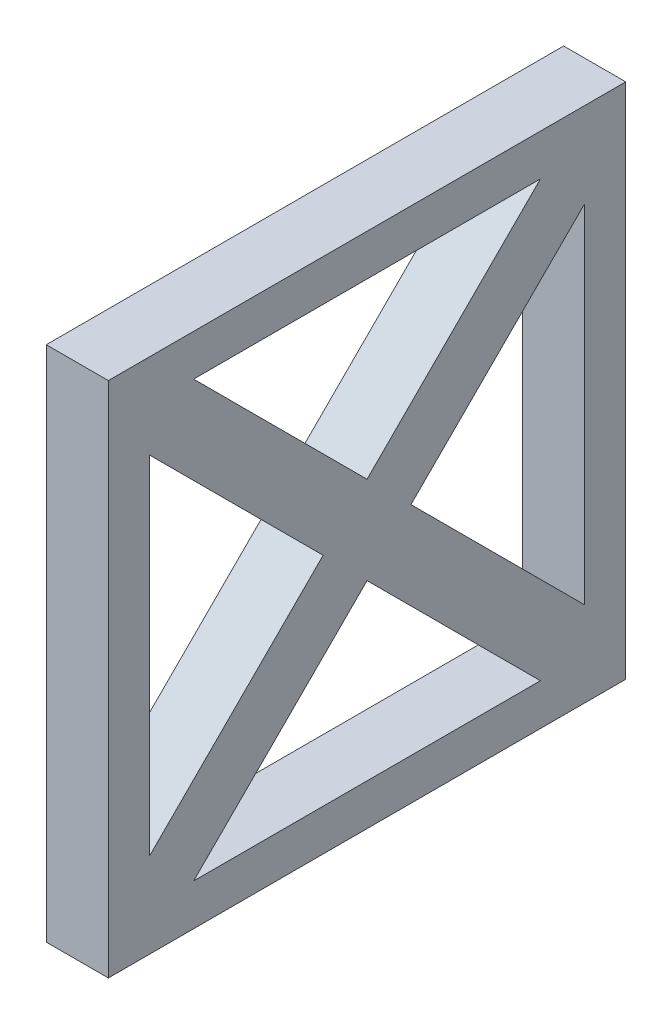
ISO-10303-21;
HEADER;
FILE_DESCRIPTION(('STEP AP214'),'2;1');
FILE_NAME('part.step','',(''),(''),'','','');
FILE_SCHEMA(('AUTOMOTIVE_DESIGN { 1 0 10303 214 1 1 1 1 }'));
ENDSEC;
DATA;
#1=APPLICATION_CONTEXT('core data for automotive mechanical design processes');
#2=APPLICATION_PROTOCOL_DEFINITION('international standard','automotive_design',2000,#1);
#3=PRODUCT_CONTEXT('',#1,'mechanical');
#4=PRODUCT('Part','Part','',(#3));
#5=PRODUCT_RELATED_PRODUCT_CATEGORY('part','',(#4));
#6=PRODUCT_DEFINITION_FORMATION('','',#4);
#7=PRODUCT_DEFINITION_CONTEXT('part definition',#1,'design');
#8=PRODUCT_DEFINITION('design','',#6,#7);
#9=PRODUCT_DEFINITION_SHAPE('','',#8);
#10=(LENGTH_UNIT() NAMED_UNIT(*) SI_UNIT(.MILLI.,.METRE.));
#11=(NAMED_UNIT(*) PLANE_ANGLE_UNIT() SI_UNIT($,.RADIAN.));
#12=(NAMED_UNIT(*) SI_UNIT($,.STERADIAN.) SOLID_ANGLE_UNIT());
#13=UNCERTAINTY_MEASURE_WITH_UNIT(LENGTH_MEASURE(1.E-05),#10,'distance_accuracy_value','');
#14=(GEOMETRIC_REPRESENTATION_CONTEXT(3) GLOBAL_UNCERTAINTY_ASSIGNED_CONTEXT((#13)) GLOBAL_UNIT_ASSIGNED_CONTEXT((#10,
#11,#12)) REPRESENTATION_CONTEXT('',''));
#15=CARTESIAN_POINT('',(0.,0.,0.));
#16=DIRECTION('',(0.,0.,1.));
#17=DIRECTION('',(1.,0.,0.));
#18=AXIS2_PLACEMENT_3D('',#15,#16,#17);
#19=CARTESIAN_POINT('',(6.,-25.,0.));
#20=DIRECTION('',(0.,-1.,0.));
#21=DIRECTION('',(0.,0.,-1.));
#22=AXIS2_PLACEMENT_3D('',#19,#20,#21);
#23=PLANE('',#22);
#24=DIRECTION('',(0.,0.,1.));
#25=VECTOR('',#24,1.);
#26=CARTESIAN_POINT('',(0.,-25.,0.));
#27=LINE('',#26,#25);
#28=CARTESIAN_POINT('',(0.,-25.,-25.));
#29=VERTEX_POINT('',#28);
#30=CARTESIAN_POINT('',(0.,-25.,25.));
#31=VERTEX_POINT('',#30);
#32=EDGE_CURVE('E290',#29,#31,#27,.T.);
#33=ORIENTED_EDGE('',*,*,#32,.F.);
#34=DIRECTION('',(-1.,0.,0.));
#35=VECTOR('',#34,1.);
#36=CARTESIAN_POINT('',(6.,-25.,-25.));
#37=LINE('',#36,#35);
#38=CARTESIAN_POINT('',(6.,-25.,-25.));
#39=VERTEX_POINT('',#38);
#40=EDGE_CURVE('E11',#39,#29,#37,.T.);
#41=ORIENTED_EDGE('',*,*,#40,.F.);
#42=DIRECTION('',(0.,0.,1.));
#43=VECTOR('',#42,1.);
#44=CARTESIAN_POINT('',(6.,-25.,0.));
#45=LINE('',#44,#43);
#46=CARTESIAN_POINT('',(6.,-25.,25.));
#47=VERTEX_POINT('',#46);
#48=EDGE_CURVE('E182',#39,#47,#45,.T.);
#49=ORIENTED_EDGE('',*,*,#48,.T.);
#50=DIRECTION('',(-1.,0.,0.));
#51=VECTOR('',#50,1.);
#52=CARTESIAN_POINT('',(6.,-25.,25.));
#53=LINE('',#52,#51);
#54=EDGE_CURVE('E67',#47,#31,#53,.T.);
#55=ORIENTED_EDGE('',*,*,#54,.T.);
#56=EDGE_LOOP('',(#33,#41,#49,#55));
#57=FACE_BOUND('',#56,.T.);
#58=ADVANCED_FACE('F47',(#57),#23,.T.);
#59=CARTESIAN_POINT('',(6.,0.,-25.));
#60=DIRECTION('',(0.,0.,1.));
#61=DIRECTION('',(1.,0.,0.));
#62=AXIS2_PLACEMENT_3D('',#59,#60,#61);
#63=PLANE('',#62);
#64=DIRECTION('',(0.,1.,0.));
#65=VECTOR('',#64,1.);
#66=CARTESIAN_POINT('',(0.,0.,-25.));
#67=LINE('',#66,#65);
#68=CARTESIAN_POINT('',(0.,25.,-25.));
#69=VERTEX_POINT('',#68);
#70=EDGE_CURVE('E188',#29,#69,#67,.T.);
#71=ORIENTED_EDGE('',*,*,#70,.T.);
#72=DIRECTION('',(-1.,0.,0.));
#73=VECTOR('',#72,1.);
#74=CARTESIAN_POINT('',(6.,25.,-25.));
#75=LINE('',#74,#73);
#76=CARTESIAN_POINT('',(6.,25.,-25.));
#77=VERTEX_POINT('',#76);
#78=EDGE_CURVE('E58',#77,#69,#75,.T.);
#79=ORIENTED_EDGE('',*,*,#78,.F.);
#80=DIRECTION('',(0.,1.,0.));
#81=VECTOR('',#80,1.);
#82=CARTESIAN_POINT('',(6.,0.,-25.));
#83=LINE('',#82,#81);
#84=EDGE_CURVE('E177',#39,#77,#83,.T.);
#85=ORIENTED_EDGE('',*,*,#84,.F.);
#86=ORIENTED_EDGE('',*,*,#40,.T.);
#87=EDGE_LOOP('',(#71,#79,#85,#86));
#88=FACE_BOUND('',#87,.T.);
#89=ADVANCED_FACE('F186',(#88),#63,.F.);
#90=CARTESIAN_POINT('',(6.,25.,0.));
#91=DIRECTION('',(0.,-1.,0.));
#92=DIRECTION('',(0.,0.,-1.));
#93=AXIS2_PLACEMENT_3D('',#90,#91,#92);
#94=PLANE('',#93);
#95=DIRECTION('',(0.,0.,1.));
#96=VECTOR('',#95,1.);
#97=CARTESIAN_POINT('',(0.,25.,0.));
#98=LINE('',#97,#96);
#99=CARTESIAN_POINT('',(0.,25.,25.));
#100=VERTEX_POINT('',#99);
#101=EDGE_CURVE('E295',#69,#100,#98,.T.);
#102=ORIENTED_EDGE('',*,*,#101,.T.);
#103=DIRECTION('',(-1.,0.,0.));
#104=VECTOR('',#103,1.);
#105=CARTESIAN_POINT('',(6.,25.,25.));
#106=LINE('',#105,#104);
#107=CARTESIAN_POINT('',(6.,25.,25.));
#108=VERTEX_POINT('',#107);
#109=EDGE_CURVE('E117',#108,#100,#106,.T.);
#110=ORIENTED_EDGE('',*,*,#109,.F.);
#111=DIRECTION('',(0.,0.,1.));
#112=VECTOR('',#111,1.);
#113=CARTESIAN_POINT('',(6.,25.,0.));
#114=LINE('',#113,#112);
#115=EDGE_CURVE('E168',#77,#108,#114,.T.);
#116=ORIENTED_EDGE('',*,*,#115,.F.);
#117=ORIENTED_EDGE('',*,*,#78,.T.);
#118=EDGE_LOOP('',(#102,#110,#116,#117));
#119=FACE_BOUND('',#118,.T.);
#120=ADVANCED_FACE('F170',(#119),#94,.F.);
#121=CARTESIAN_POINT('',(6.,-2.12132034355963,2.12132034355963));
#122=DIRECTION('',(0.,0.707106781186547,-0.707106781186547));
#123=DIRECTION('',(0.,0.707106781186548,0.707106781186548));
#124=AXIS2_PLACEMENT_3D('',#121,#122,#123);
#125=PLANE('',#124);
#126=DIRECTION('',(0.,-0.707106781186548,-0.707106781186548));
#127=VECTOR('',#126,1.);
#128=CARTESIAN_POINT('',(0.,-2.12132034355963,2.12132034355963));
#129=LINE('',#128,#127);
#130=CARTESIAN_POINT('',(0.,16.7573593128807,21.));
#131=VERTEX_POINT('',#130);
#132=CARTESIAN_POINT('',(0.,0.,4.24264068711927));
#133=VERTEX_POINT('',#132);
#134=EDGE_CURVE('E279',#131,#133,#129,.T.);
#135=ORIENTED_EDGE('',*,*,#134,.T.);
#136=DIRECTION('',(-1.,0.,0.));
#137=VECTOR('',#136,1.);
#138=CARTESIAN_POINT('',(6.,0.,4.24264068711927));
#139=LINE('',#138,#137);
#140=CARTESIAN_POINT('',(6.,0.,4.24264068711927));
#141=VERTEX_POINT('',#140);
#142=EDGE_CURVE('E203',#141,#133,#139,.T.);
#143=ORIENTED_EDGE('',*,*,#142,.F.);
#144=DIRECTION('',(0.,-0.707106781186548,-0.707106781186548));
#145=VECTOR('',#144,1.);
#146=CARTESIAN_POINT('',(6.,-2.12132034355963,2.12132034355963));
#147=LINE('',#146,#145);
#148=CARTESIAN_POINT('',(6.,16.7573593128807,21.));
#149=VERTEX_POINT('',#148);
#150=EDGE_CURVE('E335',#149,#141,#147,.T.);
#151=ORIENTED_EDGE('',*,*,#150,.F.);
#152=DIRECTION('',(-1.,0.,0.));
#153=VECTOR('',#152,1.);
#154=CARTESIAN_POINT('',(6.,16.7573593128807,21.));
#155=LINE('',#154,#153);
#156=EDGE_CURVE('E195',#149,#131,#155,.T.);
#157=ORIENTED_EDGE('',*,*,#156,.T.);
#158=EDGE_LOOP('',(#135,#143,#151,#157));
#159=FACE_BOUND('',#158,.T.);
#160=ADVANCED_FACE('F377',(#159),#125,.F.);
#161=CARTESIAN_POINT('',(6.,2.12132034355963,2.12132034355963));
#162=DIRECTION('',(0.,0.707106781186547,0.707106781186547));
#163=DIRECTION('',(0.,-0.707106781186548,0.707106781186548));
#164=AXIS2_PLACEMENT_3D('',#161,#162,#163);
#165=PLANE('',#164);
#166=DIRECTION('',(0.,0.707106781186548,-0.707106781186548));
#167=VECTOR('',#166,1.);
#168=CARTESIAN_POINT('',(0.,2.12132034355963,2.12132034355963));
#169=LINE('',#168,#167);
#170=CARTESIAN_POINT('',(0.,-16.7573593128807,21.));
#171=VERTEX_POINT('',#170);
#172=EDGE_CURVE('E283',#171,#133,#169,.T.);
#173=ORIENTED_EDGE('',*,*,#172,.F.);
#174=DIRECTION('',(-1.,0.,0.));
#175=VECTOR('',#174,1.);
#176=CARTESIAN_POINT('',(6.,-16.7573593128807,21.));
#177=LINE('',#176,#175);
#178=CARTESIAN_POINT('',(6.,-16.7573593128807,21.));
#179=VERTEX_POINT('',#178);
#180=EDGE_CURVE('E199',#179,#171,#177,.T.);
#181=ORIENTED_EDGE('',*,*,#180,.F.);
#182=DIRECTION('',(0.,0.707106781186548,-0.707106781186548));
#183=VECTOR('',#182,1.);
#184=CARTESIAN_POINT('',(6.,2.12132034355963,2.12132034355963));
#185=LINE('',#184,#183);
#186=EDGE_CURVE('E338',#179,#141,#185,.T.);
#187=ORIENTED_EDGE('',*,*,#186,.T.);
#188=ORIENTED_EDGE('',*,*,#142,.T.);
#189=EDGE_LOOP('',(#173,#181,#187,#188));
#190=FACE_BOUND('',#189,.T.);
#191=ADVANCED_FACE('F373',(#190),#165,.T.);
#192=CARTESIAN_POINT('',(6.,-2.12132034355964,-2.12132034355964));
#193=DIRECTION('',(0.,0.707106781186547,0.707106781186547));
#194=DIRECTION('',(0.,-0.707106781186548,0.707106781186548));
#195=AXIS2_PLACEMENT_3D('',#192,#193,#194);
#196=PLANE('',#195);
#197=DIRECTION('',(0.,0.707106781186548,-0.707106781186548));
#198=VECTOR('',#197,1.);
#199=CARTESIAN_POINT('',(0.,-2.12132034355964,-2.12132034355964));
#200=LINE('',#199,#198);
#201=CARTESIAN_POINT('',(0.,-21.,16.7573593128807));
#202=VERTEX_POINT('',#201);
#203=CARTESIAN_POINT('',(0.,-4.24264068711928,0.));
#204=VERTEX_POINT('',#203);
#205=EDGE_CURVE('E269',#202,#204,#200,.T.);
#206=ORIENTED_EDGE('',*,*,#205,.T.);
#207=DIRECTION('',(-1.,0.,0.));
#208=VECTOR('',#207,1.);
#209=CARTESIAN_POINT('',(6.,-4.24264068711928,0.));
#210=LINE('',#209,#208);
#211=CARTESIAN_POINT('',(6.,-4.24264068711928,0.));
#212=VERTEX_POINT('',#211);
#213=EDGE_CURVE('E200',#212,#204,#210,.T.);
#214=ORIENTED_EDGE('',*,*,#213,.F.);
#215=DIRECTION('',(0.,0.707106781186548,-0.707106781186548));
#216=VECTOR('',#215,1.);
#217=CARTESIAN_POINT('',(6.,-2.12132034355964,-2.12132034355964));
#218=LINE('',#217,#216);
#219=CARTESIAN_POINT('',(6.,-21.,16.7573593128807));
#220=VERTEX_POINT('',#219);
#221=EDGE_CURVE('E325',#220,#212,#218,.T.);
#222=ORIENTED_EDGE('',*,*,#221,.F.);
#223=DIRECTION('',(-1.,0.,0.));
#224=VECTOR('',#223,1.);
#225=CARTESIAN_POINT('',(6.,-21.,16.7573593128807));
#226=LINE('',#225,#224);
#227=EDGE_CURVE('E206',#220,#202,#226,.T.);
#228=ORIENTED_EDGE('',*,*,#227,.T.);
#229=EDGE_LOOP('',(#206,#214,#222,#228));
#230=FACE_BOUND('',#229,.T.);
#231=ADVANCED_FACE('F376',(#230),#196,.F.);
#232=CARTESIAN_POINT('',(6.,-2.12132034355963,2.12132034355963));
#233=DIRECTION('',(0.,0.707106781186547,-0.707106781186547));
#234=DIRECTION('',(0.,0.707106781186548,0.707106781186548));
#235=AXIS2_PLACEMENT_3D('',#232,#233,#234);
#236=PLANE('',#235);
#237=DIRECTION('',(0.,-0.707106781186548,-0.707106781186548));
#238=VECTOR('',#237,1.);
#239=CARTESIAN_POINT('',(0.,-2.12132034355963,2.12132034355963));
#240=LINE('',#239,#238);
#241=CARTESIAN_POINT('',(0.,-21.,-16.7573593128807));
#242=VERTEX_POINT('',#241);
#243=EDGE_CURVE('E273',#204,#242,#240,.T.);
#244=ORIENTED_EDGE('',*,*,#243,.T.);
#245=DIRECTION('',(-1.,0.,0.));
#246=VECTOR('',#245,1.);
#247=CARTESIAN_POINT('',(6.,-21.,-16.7573593128807));
#248=LINE('',#247,#246);
#249=CARTESIAN_POINT('',(6.,-21.,-16.7573593128807));
#250=VERTEX_POINT('',#249);
#251=EDGE_CURVE('E210',#250,#242,#248,.T.);
#252=ORIENTED_EDGE('',*,*,#251,.F.);
#253=DIRECTION('',(0.,-0.707106781186548,-0.707106781186548));
#254=VECTOR('',#253,1.);
#255=CARTESIAN_POINT('',(6.,-2.12132034355963,2.12132034355963));
#256=LINE('',#255,#254);
#257=EDGE_CURVE('E329',#212,#250,#256,.T.);
#258=ORIENTED_EDGE('',*,*,#257,.F.);
#259=ORIENTED_EDGE('',*,*,#213,.T.);
#260=EDGE_LOOP('',(#244,#252,#258,#259));
#261=FACE_BOUND('',#260,.T.);
#262=ADVANCED_FACE('F385',(#261),#236,.F.);
#263=CARTESIAN_POINT('',(6.,2.12132034355963,2.12132034355963));
#264=DIRECTION('',(0.,0.707106781186547,0.707106781186547));
#265=DIRECTION('',(0.,-0.707106781186548,0.707106781186548));
#266=AXIS2_PLACEMENT_3D('',#263,#264,#265);
#267=PLANE('',#266);
#268=DIRECTION('',(0.,0.707106781186548,-0.707106781186548));
#269=VECTOR('',#268,1.);
#270=CARTESIAN_POINT('',(0.,2.12132034355963,2.12132034355963));
#271=LINE('',#270,#269);
#272=CARTESIAN_POINT('',(0.,4.24264068711928,0.));
#273=VERTEX_POINT('',#272);
#274=CARTESIAN_POINT('',(0.,21.,-16.7573593128807));
#275=VERTEX_POINT('',#274);
#276=EDGE_CURVE('E257',#273,#275,#271,.T.);
#277=ORIENTED_EDGE('',*,*,#276,.F.);
#278=DIRECTION('',(-1.,0.,0.));
#279=VECTOR('',#278,1.);
#280=CARTESIAN_POINT('',(6.,4.24264068711928,0.));
#281=LINE('',#280,#279);
#282=CARTESIAN_POINT('',(6.,4.24264068711928,0.));
#283=VERTEX_POINT('',#282);
#284=EDGE_CURVE('E211',#283,#273,#281,.T.);
#285=ORIENTED_EDGE('',*,*,#284,.F.);
#286=DIRECTION('',(0.,0.707106781186548,-0.707106781186548));
#287=VECTOR('',#286,1.);
#288=CARTESIAN_POINT('',(6.,2.12132034355963,2.12132034355963));
#289=LINE('',#288,#287);
#290=CARTESIAN_POINT('',(6.,21.,-16.7573593128807));
#291=VERTEX_POINT('',#290);
#292=EDGE_CURVE('E313',#283,#291,#289,.T.);
#293=ORIENTED_EDGE('',*,*,#292,.T.);
#294=DIRECTION('',(-1.,0.,0.));
#295=VECTOR('',#294,1.);
#296=CARTESIAN_POINT('',(6.,21.,-16.7573593128807));
#297=LINE('',#296,#295);
#298=EDGE_CURVE('E218',#291,#275,#297,.T.);
#299=ORIENTED_EDGE('',*,*,#298,.T.);
#300=EDGE_LOOP('',(#277,#285,#293,#299));
#301=FACE_BOUND('',#300,.T.);
#302=ADVANCED_FACE('F388',(#301),#267,.T.);
#303=CARTESIAN_POINT('',(6.,2.12132034355964,-2.12132034355964));
#304=DIRECTION('',(0.,0.707106781186547,-0.707106781186547));
#305=DIRECTION('',(0.,0.707106781186548,0.707106781186548));
#306=AXIS2_PLACEMENT_3D('',#303,#304,#305);
#307=PLANE('',#306);
#308=DIRECTION('',(0.,-0.707106781186548,-0.707106781186548));
#309=VECTOR('',#308,1.);
#310=CARTESIAN_POINT('',(0.,2.12132034355964,-2.12132034355964));
#311=LINE('',#310,#309);
#312=CARTESIAN_POINT('',(0.,21.,16.7573593128807));
#313=VERTEX_POINT('',#312);
#314=EDGE_CURVE('E261',#313,#273,#311,.T.);
#315=ORIENTED_EDGE('',*,*,#314,.F.);
#316=DIRECTION('',(-1.,0.,0.));
#317=VECTOR('',#316,1.);
#318=CARTESIAN_POINT('',(6.,21.,16.7573593128807));
#319=LINE('',#318,#317);
#320=CARTESIAN_POINT('',(6.,21.,16.7573593128807));
#321=VERTEX_POINT('',#320);
#322=EDGE_CURVE('E221',#321,#313,#319,.T.);
#323=ORIENTED_EDGE('',*,*,#322,.F.);
#324=DIRECTION('',(0.,-0.707106781186548,-0.707106781186548));
#325=VECTOR('',#324,1.);
#326=CARTESIAN_POINT('',(6.,2.12132034355964,-2.12132034355964));
#327=LINE('',#326,#325);
#328=EDGE_CURVE('E317',#321,#283,#327,.T.);
#329=ORIENTED_EDGE('',*,*,#328,.T.);
#330=ORIENTED_EDGE('',*,*,#284,.T.);
#331=EDGE_LOOP('',(#315,#323,#329,#330));
#332=FACE_BOUND('',#331,.T.);
#333=ADVANCED_FACE('F396',(#332),#307,.T.);
#334=CARTESIAN_POINT('',(6.,2.12132034355964,-2.12132034355964));
#335=DIRECTION('',(0.,0.707106781186547,-0.707106781186547));
#336=DIRECTION('',(0.,0.707106781186548,0.707106781186548));
#337=AXIS2_PLACEMENT_3D('',#334,#335,#336);
#338=PLANE('',#337);
#339=DIRECTION('',(0.,-0.707106781186548,-0.707106781186548));
#340=VECTOR('',#339,1.);
#341=CARTESIAN_POINT('',(0.,2.12132034355964,-2.12132034355964));
#342=LINE('',#341,#340);
#343=CARTESIAN_POINT('',(0.,0.,-4.24264068711929));
#344=VERTEX_POINT('',#343);
#345=CARTESIAN_POINT('',(0.,-16.7573593128807,-21.));
#346=VERTEX_POINT('',#345);
#347=EDGE_CURVE('E247',#344,#346,#342,.T.);
#348=ORIENTED_EDGE('',*,*,#347,.F.);
#349=DIRECTION('',(-1.,0.,0.));
#350=VECTOR('',#349,1.);
#351=CARTESIAN_POINT('',(6.,0.,-4.24264068711929));
#352=LINE('',#351,#350);
#353=CARTESIAN_POINT('',(6.,0.,-4.24264068711929));
#354=VERTEX_POINT('',#353);
#355=EDGE_CURVE('E51',#354,#344,#352,.T.);
#356=ORIENTED_EDGE('',*,*,#355,.F.);
#357=DIRECTION('',(0.,-0.707106781186548,-0.707106781186548));
#358=VECTOR('',#357,1.);
#359=CARTESIAN_POINT('',(6.,2.12132034355964,-2.12132034355964));
#360=LINE('',#359,#358);
#361=CARTESIAN_POINT('',(6.,-16.7573593128807,-21.));
#362=VERTEX_POINT('',#361);
#363=EDGE_CURVE('E301',#354,#362,#360,.T.);
#364=ORIENTED_EDGE('',*,*,#363,.T.);
#365=DIRECTION('',(-1.,0.,0.));
#366=VECTOR('',#365,1.);
#367=CARTESIAN_POINT('',(6.,-16.7573593128807,-21.));
#368=LINE('',#367,#366);
#369=EDGE_CURVE('E226',#362,#346,#368,.T.);
#370=ORIENTED_EDGE('',*,*,#369,.T.);
#371=EDGE_LOOP('',(#348,#356,#364,#370));
#372=FACE_BOUND('',#371,.T.);
#373=ADVANCED_FACE('F49',(#372),#338,.T.);
#374=CARTESIAN_POINT('',(6.,-2.12132034355964,-2.12132034355964));
#375=DIRECTION('',(0.,0.707106781186547,0.707106781186547));
#376=DIRECTION('',(0.,-0.707106781186548,0.707106781186548));
#377=AXIS2_PLACEMENT_3D('',#374,#375,#376);
#378=PLANE('',#377);
#379=DIRECTION('',(0.,0.707106781186548,-0.707106781186548));
#380=VECTOR('',#379,1.);
#381=CARTESIAN_POINT('',(0.,-2.12132034355964,-2.12132034355964));
#382=LINE('',#381,#380);
#383=CARTESIAN_POINT('',(0.,16.7573593128807,-21.));
#384=VERTEX_POINT('',#383);
#385=EDGE_CURVE('E239',#344,#384,#382,.T.);
#386=ORIENTED_EDGE('',*,*,#385,.T.);
#387=DIRECTION('',(-1.,0.,0.));
#388=VECTOR('',#387,1.);
#389=CARTESIAN_POINT('',(6.,16.7573593128807,-21.));
#390=LINE('',#389,#388);
#391=CARTESIAN_POINT('',(6.,16.7573593128807,-21.));
#392=VERTEX_POINT('',#391);
#393=EDGE_CURVE('E228',#392,#384,#390,.T.);
#394=ORIENTED_EDGE('',*,*,#393,.F.);
#395=DIRECTION('',(0.,0.707106781186548,-0.707106781186548));
#396=VECTOR('',#395,1.);
#397=CARTESIAN_POINT('',(6.,-2.12132034355964,-2.12132034355964));
#398=LINE('',#397,#396);
#399=EDGE_CURVE('E241',#354,#392,#398,.T.);
#400=ORIENTED_EDGE('',*,*,#399,.F.);
#401=ORIENTED_EDGE('',*,*,#355,.T.);
#402=EDGE_LOOP('',(#386,#394,#400,#401));
#403=FACE_BOUND('',#402,.T.);
#404=ADVANCED_FACE('F238',(#403),#378,.F.);
#405=CARTESIAN_POINT('',(6.,0.,21.));
#406=DIRECTION('',(0.,0.,1.));
#407=DIRECTION('',(1.,0.,0.));
#408=AXIS2_PLACEMENT_3D('',#405,#406,#407);
#409=PLANE('',#408);
#410=DIRECTION('',(0.,1.,0.));
#411=VECTOR('',#410,1.);
#412=CARTESIAN_POINT('',(0.,0.,21.));
#413=LINE('',#412,#411);
#414=EDGE_CURVE('E287',#171,#131,#413,.T.);
#415=ORIENTED_EDGE('',*,*,#414,.T.);
#416=ORIENTED_EDGE('',*,*,#156,.F.);
#417=DIRECTION('',(0.,1.,0.));
#418=VECTOR('',#417,1.);
#419=CARTESIAN_POINT('',(6.,0.,21.));
#420=LINE('',#419,#418);
#421=EDGE_CURVE('E342',#179,#149,#420,.T.);
#422=ORIENTED_EDGE('',*,*,#421,.F.);
#423=ORIENTED_EDGE('',*,*,#180,.T.);
#424=EDGE_LOOP('',(#415,#416,#422,#423));
#425=FACE_BOUND('',#424,.T.);
#426=ADVANCED_FACE('F368',(#425),#409,.F.);
#427=CARTESIAN_POINT('',(6.,-21.,0.));
#428=DIRECTION('',(0.,-1.,0.));
#429=DIRECTION('',(0.,0.,-1.));
#430=AXIS2_PLACEMENT_3D('',#427,#428,#429);
#431=PLANE('',#430);
#432=DIRECTION('',(0.,0.,1.));
#433=VECTOR('',#432,1.);
#434=CARTESIAN_POINT('',(0.,-21.,0.));
#435=LINE('',#434,#433);
#436=EDGE_CURVE('E276',#242,#202,#435,.T.);
#437=ORIENTED_EDGE('',*,*,#436,.T.);
#438=ORIENTED_EDGE('',*,*,#227,.F.);
#439=DIRECTION('',(0.,0.,1.));
#440=VECTOR('',#439,1.);
#441=CARTESIAN_POINT('',(6.,-21.,0.));
#442=LINE('',#441,#440);
#443=EDGE_CURVE('E332',#250,#220,#442,.T.);
#444=ORIENTED_EDGE('',*,*,#443,.F.);
#445=ORIENTED_EDGE('',*,*,#251,.T.);
#446=EDGE_LOOP('',(#437,#438,#444,#445));
#447=FACE_BOUND('',#446,.T.);
#448=ADVANCED_FACE('F371',(#447),#431,.F.);
#449=CARTESIAN_POINT('',(6.,21.,0.));
#450=DIRECTION('',(0.,-1.,0.));
#451=DIRECTION('',(0.,0.,-1.));
#452=AXIS2_PLACEMENT_3D('',#449,#450,#451);
#453=PLANE('',#452);
#454=DIRECTION('',(0.,0.,1.));
#455=VECTOR('',#454,1.);
#456=CARTESIAN_POINT('',(0.,21.,0.));
#457=LINE('',#456,#455);
#458=EDGE_CURVE('E265',#275,#313,#457,.T.);
#459=ORIENTED_EDGE('',*,*,#458,.F.);
#460=ORIENTED_EDGE('',*,*,#298,.F.);
#461=DIRECTION('',(0.,0.,1.));
#462=VECTOR('',#461,1.);
#463=CARTESIAN_POINT('',(6.,21.,0.));
#464=LINE('',#463,#462);
#465=EDGE_CURVE('E321',#291,#321,#464,.T.);
#466=ORIENTED_EDGE('',*,*,#465,.T.);
#467=ORIENTED_EDGE('',*,*,#322,.T.);
#468=EDGE_LOOP('',(#459,#460,#466,#467));
#469=FACE_BOUND('',#468,.T.);
#470=ADVANCED_FACE('F357',(#469),#453,.T.);
#471=CARTESIAN_POINT('',(6.,0.,-21.));
#472=DIRECTION('',(0.,0.,1.));
#473=DIRECTION('',(1.,0.,0.));
#474=AXIS2_PLACEMENT_3D('',#471,#472,#473);
#475=PLANE('',#474);
#476=DIRECTION('',(0.,1.,0.));
#477=VECTOR('',#476,1.);
#478=CARTESIAN_POINT('',(0.,0.,-21.));
#479=LINE('',#478,#477);
#480=EDGE_CURVE('E248',#346,#384,#479,.T.);
#481=ORIENTED_EDGE('',*,*,#480,.F.);
#482=ORIENTED_EDGE('',*,*,#369,.F.);
#483=DIRECTION('',(0.,1.,0.));
#484=VECTOR('',#483,1.);
#485=CARTESIAN_POINT('',(6.,0.,-21.));
#486=LINE('',#485,#484);
#487=EDGE_CURVE('E308',#362,#392,#486,.T.);
#488=ORIENTED_EDGE('',*,*,#487,.T.);
#489=ORIENTED_EDGE('',*,*,#393,.T.);
#490=EDGE_LOOP('',(#481,#482,#488,#489));
#491=FACE_BOUND('',#490,.T.);
#492=ADVANCED_FACE('F349',(#491),#475,.T.);
#493=CARTESIAN_POINT('',(6.,0.,25.));
#494=DIRECTION('',(0.,0.,1.));
#495=DIRECTION('',(1.,0.,0.));
#496=AXIS2_PLACEMENT_3D('',#493,#494,#495);
#497=PLANE('',#496);
#498=DIRECTION('',(0.,1.,0.));
#499=VECTOR('',#498,1.);
#500=CARTESIAN_POINT('',(0.,0.,25.));
#501=LINE('',#500,#499);
#502=EDGE_CURVE('E298',#31,#100,#501,.T.);
#503=ORIENTED_EDGE('',*,*,#502,.F.);
#504=ORIENTED_EDGE('',*,*,#54,.F.);
#505=DIRECTION('',(0.,1.,0.));
#506=VECTOR('',#505,1.);
#507=CARTESIAN_POINT('',(6.,0.,25.));
#508=LINE('',#507,#506);
#509=EDGE_CURVE('E176',#47,#108,#508,.T.);
#510=ORIENTED_EDGE('',*,*,#509,.T.);
#511=ORIENTED_EDGE('',*,*,#109,.T.);
#512=EDGE_LOOP('',(#503,#504,#510,#511));
#513=FACE_BOUND('',#512,.T.);
#514=ADVANCED_FACE('F347',(#513),#497,.T.);
#515=CARTESIAN_POINT('',(6.,0.,0.));
#516=DIRECTION('',(1.,0.,0.));
#517=DIRECTION('',(0.,0.,-1.));
#518=AXIS2_PLACEMENT_3D('',#515,#516,#517);
#519=PLANE('',#518);
#520=ORIENTED_EDGE('',*,*,#363,.F.);
#521=ORIENTED_EDGE('',*,*,#399,.T.);
#522=ORIENTED_EDGE('',*,*,#487,.F.);
#523=EDGE_LOOP('',(#520,#521,#522));
#524=FACE_BOUND('',#523,.T.);
#525=ORIENTED_EDGE('',*,*,#292,.F.);
#526=ORIENTED_EDGE('',*,*,#328,.F.);
#527=ORIENTED_EDGE('',*,*,#465,.F.);
#528=EDGE_LOOP('',(#525,#526,#527));
#529=FACE_BOUND('',#528,.T.);
#530=ORIENTED_EDGE('',*,*,#221,.T.);
#531=ORIENTED_EDGE('',*,*,#257,.T.);
#532=ORIENTED_EDGE('',*,*,#443,.T.);
#533=EDGE_LOOP('',(#530,#531,#532));
#534=FACE_BOUND('',#533,.T.);
#535=ORIENTED_EDGE('',*,*,#150,.T.);
#536=ORIENTED_EDGE('',*,*,#186,.F.);
#537=ORIENTED_EDGE('',*,*,#421,.T.);
#538=EDGE_LOOP('',(#535,#536,#537));
#539=FACE_BOUND('',#538,.T.);
#540=ORIENTED_EDGE('',*,*,#48,.F.);
#541=ORIENTED_EDGE('',*,*,#84,.T.);
#542=ORIENTED_EDGE('',*,*,#115,.T.);
#543=ORIENTED_EDGE('',*,*,#509,.F.);
#544=EDGE_LOOP('',(#540,#541,#542,#543));
#545=FACE_BOUND('',#544,.T.);
#546=ADVANCED_FACE('F181',(#524,#529,#534,#539,#545),#519,.T.);
#547=CARTESIAN_POINT('',(0.,0.,0.));
#548=DIRECTION('',(1.,0.,0.));
#549=DIRECTION('',(0.,0.,-1.));
#550=AXIS2_PLACEMENT_3D('',#547,#548,#549);
#551=PLANE('',#550);
#552=ORIENTED_EDGE('',*,*,#347,.T.);
#553=ORIENTED_EDGE('',*,*,#480,.T.);
#554=ORIENTED_EDGE('',*,*,#385,.F.);
#555=EDGE_LOOP('',(#552,#553,#554));
#556=FACE_BOUND('',#555,.T.);
#557=ORIENTED_EDGE('',*,*,#276,.T.);
#558=ORIENTED_EDGE('',*,*,#458,.T.);
#559=ORIENTED_EDGE('',*,*,#314,.T.);
#560=EDGE_LOOP('',(#557,#558,#559));
#561=FACE_BOUND('',#560,.T.);
#562=ORIENTED_EDGE('',*,*,#205,.F.);
#563=ORIENTED_EDGE('',*,*,#436,.F.);
#564=ORIENTED_EDGE('',*,*,#243,.F.);
#565=EDGE_LOOP('',(#562,#563,#564));
#566=FACE_BOUND('',#565,.T.);
#567=ORIENTED_EDGE('',*,*,#134,.F.);
#568=ORIENTED_EDGE('',*,*,#414,.F.);
#569=ORIENTED_EDGE('',*,*,#172,.T.);
#570=EDGE_LOOP('',(#567,#568,#569));
#571=FACE_BOUND('',#570,.T.);
#572=ORIENTED_EDGE('',*,*,#32,.T.);
#573=ORIENTED_EDGE('',*,*,#502,.T.);
#574=ORIENTED_EDGE('',*,*,#101,.F.);
#575=ORIENTED_EDGE('',*,*,#70,.F.);
#576=EDGE_LOOP('',(#572,#573,#574,#575));
#577=FACE_BOUND('',#576,.T.);
#578=ADVANCED_FACE('F245',(#556,#561,#566,#571,#577),#551,.F.);
#579=CLOSED_SHELL('',(#58,#89,#120,#160,#191,#231,#262,#302,#333,#373,#404,#426,#448,#470,#492,
#514,#546,#578));
#580=MANIFOLD_SOLID_BREP('B2',#579);
#581=ADVANCED_BREP_SHAPE_REPRESENTATION('',(#18,#580),#14);
#582=SHAPE_DEFINITION_REPRESENTATION(#9,#581);
ENDSEC;
END-ISO-10303-21;
